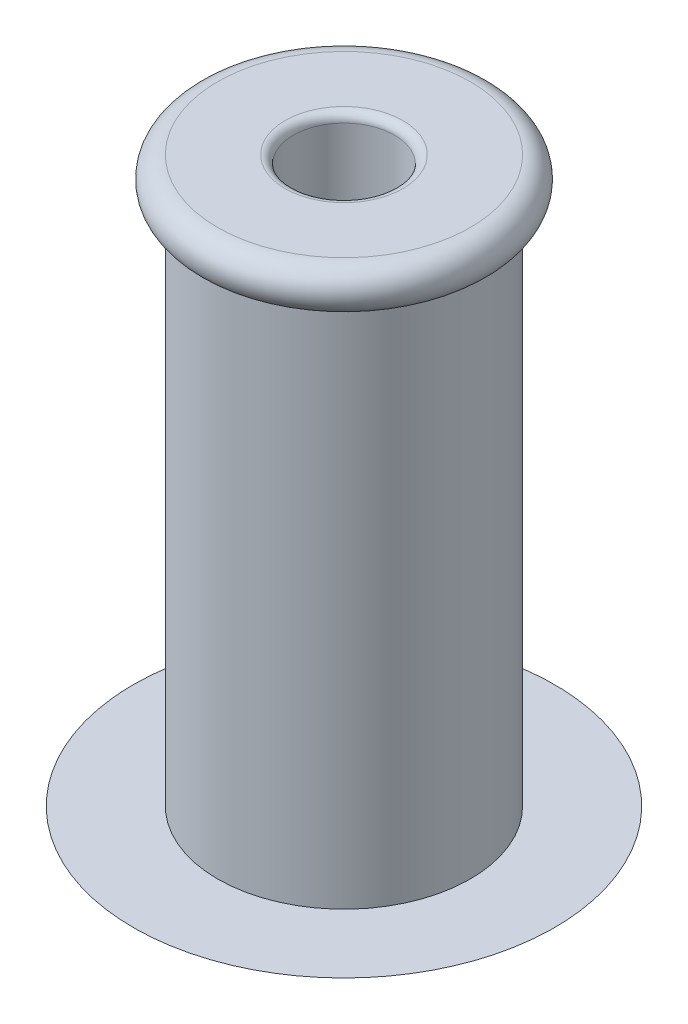
ISO-10303-21;
HEADER;
FILE_DESCRIPTION(('STEP AP214'),'2;1');
FILE_NAME('part.step','',(''),(''),'','','');
FILE_SCHEMA(('AUTOMOTIVE_DESIGN { 1 0 10303 214 1 1 1 1 }'));
ENDSEC;
DATA;
#1=APPLICATION_CONTEXT('core data for automotive mechanical design processes');
#2=APPLICATION_PROTOCOL_DEFINITION('international standard','automotive_design',2000,#1);
#3=PRODUCT_CONTEXT('',#1,'mechanical');
#4=PRODUCT('Part','Part','',(#3));
#5=PRODUCT_RELATED_PRODUCT_CATEGORY('part','',(#4));
#6=PRODUCT_DEFINITION_FORMATION('','',#4);
#7=PRODUCT_DEFINITION_CONTEXT('part definition',#1,'design');
#8=PRODUCT_DEFINITION('design','',#6,#7);
#9=PRODUCT_DEFINITION_SHAPE('','',#8);
#10=(LENGTH_UNIT() NAMED_UNIT(*) SI_UNIT(.MILLI.,.METRE.));
#11=(NAMED_UNIT(*) PLANE_ANGLE_UNIT() SI_UNIT($,.RADIAN.));
#12=(NAMED_UNIT(*) SI_UNIT($,.STERADIAN.) SOLID_ANGLE_UNIT());
#13=UNCERTAINTY_MEASURE_WITH_UNIT(LENGTH_MEASURE(1.E-05),#10,'distance_accuracy_value','');
#14=(GEOMETRIC_REPRESENTATION_CONTEXT(3) GLOBAL_UNCERTAINTY_ASSIGNED_CONTEXT((#13)) GLOBAL_UNIT_ASSIGNED_CONTEXT((#10,
#11,#12)) REPRESENTATION_CONTEXT('',''));
#15=CARTESIAN_POINT('',(0.,0.,0.));
#16=DIRECTION('',(0.,0.,1.));
#17=DIRECTION('',(1.,0.,0.));
#18=AXIS2_PLACEMENT_3D('',#15,#16,#17);
#19=CARTESIAN_POINT('',(0.,6.69999999999999,0.));
#20=DIRECTION('',(0.,1.,0.));
#21=DIRECTION('',(0.,0.,1.));
#22=AXIS2_PLACEMENT_3D('',#19,#20,#21);
#23=CYLINDRICAL_SURFACE('',#22,0.599999999999996);
#24=CARTESIAN_POINT('',(0.,-0.429212761787368,0.));
#25=DIRECTION('',(0.,1.,0.));
#26=DIRECTION('',(0.,0.,1.));
#27=AXIS2_PLACEMENT_3D('',#24,#25,#26);
#28=CIRCLE('',#27,0.599999999999996);
#29=CARTESIAN_POINT('',(0.,-0.429212761787368,0.599999999999996));
#30=VERTEX_POINT('',#29);
#31=EDGE_CURVE('E138',#30,#30,#28,.T.);
#32=ORIENTED_EDGE('',*,*,#31,.F.);
#33=EDGE_LOOP('',(#32));
#34=FACE_BOUND('',#33,.T.);
#35=CARTESIAN_POINT('',(0.,6.60000000003306,0.));
#36=DIRECTION('',(0.,1.,0.));
#37=DIRECTION('',(0.,0.,1.));
#38=AXIS2_PLACEMENT_3D('',#35,#36,#37);
#39=CIRCLE('',#38,0.599999999999998);
#40=CARTESIAN_POINT('',(0.,6.60000000003306,0.599999999999998));
#41=VERTEX_POINT('',#40);
#42=EDGE_CURVE('E130',#41,#41,#39,.F.);
#43=ORIENTED_EDGE('',*,*,#42,.F.);
#44=EDGE_LOOP('',(#43));
#45=FACE_BOUND('',#44,.T.);
#46=ADVANCED_FACE('F17',(#34,#45),#23,.F.);
#47=CARTESIAN_POINT('',(0.,-0.429212761787368,0.));
#48=DIRECTION('',(0.,1.,0.));
#49=DIRECTION('',(0.,0.,1.));
#50=AXIS2_PLACEMENT_3D('',#47,#48,#49);
#51=TOROIDAL_SURFACE('',#50,0.700035848417031,0.100035848417034);
#52=CARTESIAN_POINT('',(0.,-0.528480229082224,0.));
#53=DIRECTION('',(0.,1.,0.));
#54=DIRECTION('',(0.,0.,1.));
#55=AXIS2_PLACEMENT_3D('',#52,#53,#54);
#56=CIRCLE('',#55,0.712410859745534);
#57=CARTESIAN_POINT('',(0.,-0.528480229082224,0.712410859745534));
#58=VERTEX_POINT('',#57);
#59=EDGE_CURVE('E56',#58,#58,#56,.T.);
#60=ORIENTED_EDGE('',*,*,#59,.F.);
#61=EDGE_LOOP('',(#60));
#62=FACE_BOUND('',#61,.T.);
#63=ORIENTED_EDGE('',*,*,#31,.T.);
#64=EDGE_LOOP('',(#63));
#65=FACE_BOUND('',#64,.T.);
#66=ADVANCED_FACE('F146',(#62,#65),#51,.T.);
#67=CARTESIAN_POINT('',(0.,6.60000000003306,0.));
#68=DIRECTION('',(0.,1.,0.));
#69=DIRECTION('',(0.,0.,1.));
#70=AXIS2_PLACEMENT_3D('',#67,#68,#69);
#71=TOROIDAL_SURFACE('',#70,0.699999999966935,0.0999999999669373);
#72=ORIENTED_EDGE('',*,*,#42,.T.);
#73=EDGE_LOOP('',(#72));
#74=FACE_BOUND('',#73,.T.);
#75=CARTESIAN_POINT('',(0.,6.7,0.));
#76=DIRECTION('',(0.,1.,0.));
#77=DIRECTION('',(0.,0.,1.));
#78=AXIS2_PLACEMENT_3D('',#75,#76,#77);
#79=CIRCLE('',#78,0.699999999969966);
#80=CARTESIAN_POINT('',(0.,6.69999999999999,0.699999999971178));
#81=VERTEX_POINT('',#80);
#82=CARTESIAN_POINT('',(0.,6.69999999999999,-0.699999999971178));
#83=VERTEX_POINT('',#82);
#84=EDGE_CURVE('E47',#81,#83,#79,.T.);
#85=ORIENTED_EDGE('',*,*,#84,.T.);
#86=CARTESIAN_POINT('',(0.,6.7,0.));
#87=DIRECTION('',(0.,1.,0.));
#88=DIRECTION('',(0.,0.,-1.));
#89=AXIS2_PLACEMENT_3D('',#86,#87,#88);
#90=CIRCLE('',#89,0.699999999969966);
#91=EDGE_CURVE('E45',#83,#81,#90,.T.);
#92=ORIENTED_EDGE('',*,*,#91,.T.);
#93=EDGE_LOOP('',(#85,#92));
#94=FACE_BOUND('',#93,.T.);
#95=ADVANCED_FACE('F49',(#74,#94),#71,.T.);
#96=CARTESIAN_POINT('',(5.74704163652882E-10,5.16876422981444,0.));
#97=DIRECTION('',(1.,0.,0.));
#98=DIRECTION('',(0.,-1.,0.));
#99=AXIS2_PLACEMENT_3D('',#96,#97,#98);
#100=SPHERICAL_SURFACE('',#99,5.74161333221711);
#101=CARTESIAN_POINT('',(-2.49999999942357,6.48838540404442E-10,0.));
#102=CARTESIAN_POINT('',(-2.49999957878489,6.48831726204016E-10,-0.0701921599959424));
#103=CARTESIAN_POINT('',(-2.49704119285071,6.48806599485893E-10,-0.140397219697355));
#104=CARTESIAN_POINT('',(-2.48522688279269,6.48870978717356E-10,-0.280322179188547));
#105=CARTESIAN_POINT('',(-2.47636921753083,6.48960518517301E-10,-0.350041929601709));
#106=CARTESIAN_POINT('',(-2.45279619976664,6.48716856477371E-10,-0.488604766514141));
#107=CARTESIAN_POINT('',(-2.4380715488539,6.48382981738096E-10,-0.557446281525052));
#108=CARTESIAN_POINT('',(-2.40286605931459,6.49294957619581E-10,-0.693682439580464));
#109=CARTESIAN_POINT('',(-2.38238054950445,6.50542093090779E-10,-0.761075860507156));
#110=CARTESIAN_POINT('',(-2.31256595505668,6.51898547981041E-10,-0.960073508547201));
#111=CARTESIAN_POINT('',(-2.25482146080076,6.49640201267501E-10,-1.08883001715263));
#112=CARTESIAN_POINT('',(-2.11850508000272,6.4803733696389E-10,-1.33480670427791));
#113=CARTESIAN_POINT('',(-2.03993240172298,6.48692930155779E-10,-1.45202644402053));
#114=CARTESIAN_POINT('',(-1.90824104240077,6.48912864567597E-10,-1.61665670241038));
#115=CARTESIAN_POINT('',(-1.86200376338034,6.48858647756231E-10,-1.66969790909631));
#116=CARTESIAN_POINT('',(-1.76526174273879,6.48818940094947E-10,-1.77166010119695));
#117=CARTESIAN_POINT('',(-1.71476115857592,6.48833383033251E-10,-1.82058500981916));
#118=CARTESIAN_POINT('',(-1.60979378862723,6.48844188113362E-10,-1.91402800841851));
#119=CARTESIAN_POINT('',(-1.55532521654812,6.48840542061755E-10,-1.95854409210429));
#120=CARTESIAN_POINT('',(-1.44283652680054,6.48837026231001E-10,-2.04283394018589));
#121=CARTESIAN_POINT('',(-1.38481558947582,6.48837157326676E-10,-2.0826066038189));
#122=CARTESIAN_POINT('',(-1.20605688595961,6.48837809554355E-10,-2.19433902055693));
#123=CARTESIAN_POINT('',(-1.08051229794067,6.48838589359884E-10,-2.25881176834384));
#124=CARTESIAN_POINT('',(-0.820448664375309,6.48838979337895E-10,-2.36572576688446));
#125=CARTESIAN_POINT('',(-0.685929714696595,6.4883858952287E-10,-2.40816725294235));
#126=CARTESIAN_POINT('',(-0.411658452249914,6.48838762337019E-10,-2.46987540914088));
#127=CARTESIAN_POINT('',(-0.27190611153753,6.48839324971279E-10,-2.48914195551749));
#128=CARTESIAN_POINT('',(0.00884938408520357,6.48838243728583E-10,-2.50393336511436));
#129=CARTESIAN_POINT('',(0.149852538995552,6.48836599851625E-10,-2.49945822833461));
#130=CARTESIAN_POINT('',(0.429089566885955,6.48836848879317E-10,-2.46691127455344));
#131=CARTESIAN_POINT('',(0.567323454650985,6.48838741765079E-10,-2.43883958356721));
#132=CARTESIAN_POINT('',(0.837181598480677,6.48838826935238E-10,-2.35984414828166));
#133=CARTESIAN_POINT('',(0.968805783933406,6.4883701918011E-10,-2.3089201599073));
#134=CARTESIAN_POINT('',(1.15831539903678,6.48837715613109E-10,-2.21658970547161));
#135=CARTESIAN_POINT('',(1.2201943286004,6.48838517075551E-10,-2.18313388360806));
#136=CARTESIAN_POINT('',(1.34091721277493,6.48839051562421E-10,-2.11113062640851));
#137=CARTESIAN_POINT('',(1.39976186683971,6.48838784834212E-10,-2.0725843718686));
#138=CARTESIAN_POINT('',(1.51396685381964,6.4883878386587E-10,-1.99068831768951));
#139=CARTESIAN_POINT('',(1.56932875232432,6.48839049384689E-10,-1.94734070093333));
#140=CARTESIAN_POINT('',(1.67624909576441,6.48838519059393E-10,-1.85610831997998));
#141=CARTESIAN_POINT('',(1.72780381849562,6.48837722190731E-10,-1.80821921744076));
#142=CARTESIAN_POINT('',(1.87606499450712,6.48836681188863E-10,-1.6583380652391));
#143=CARTESIAN_POINT('',(1.96651979617871,6.48837781047235E-10,-1.55002342166796));
#144=CARTESIAN_POINT('',(2.12792802579951,6.48839787614484E-10,-1.31973215024518));
#145=CARTESIAN_POINT('',(2.19888219499795,6.48840694330701E-10,-1.1977560419351));
#146=CARTESIAN_POINT('',(2.28922037116787,6.48839739506078E-10,-1.00719593212774));
#147=CARTESIAN_POINT('',(2.31667397120977,6.48839033189682E-10,-0.94232815013128));
#148=CARTESIAN_POINT('',(2.36599984839916,6.48838535712372E-10,-0.810545468814853));
#149=CARTESIAN_POINT('',(2.38787664245458,6.48838743808326E-10,-0.743632275680957));
#150=CARTESIAN_POINT('',(2.42587892450651,6.48838824827128E-10,-0.608313490959032));
#151=CARTESIAN_POINT('',(2.44201349431108,6.48838698281935E-10,-0.539910439208492));
#152=CARTESIAN_POINT('',(2.4684652914803,6.48838870392521E-10,-0.402001503177163));
#153=CARTESIAN_POINT('',(2.47878423464813,6.48839168922797E-10,-0.332495950399554));
#154=CARTESIAN_POINT('',(2.49076984043968,6.48838326543593E-10,-0.219068891487443));
#155=CARTESIAN_POINT('',(2.4942300551381,6.48837683507477E-10,-0.175328990097495));
#156=CARTESIAN_POINT('',(2.49884526664322,6.48839885192385E-10,-0.0877277385033082));
#157=CARTESIAN_POINT('',(2.50000026344992,6.48842729913408E-10,-0.0438663882990687));
#158=CARTESIAN_POINT('',(2.4999995799343,6.48831625192481E-10,0.0701921599959423));
#159=CARTESIAN_POINT('',(2.49704119400011,6.48806572417351E-10,0.140397219697354));
#160=CARTESIAN_POINT('',(2.4852268839421,6.48871005793892E-10,0.280322179188546));
#161=CARTESIAN_POINT('',(2.47636921868024,6.48960525768236E-10,0.350041929601709));
#162=CARTESIAN_POINT('',(2.45279620091605,6.48716849214899E-10,0.488604766514141));
#163=CARTESIAN_POINT('',(2.4380715500033,6.48382979827868E-10,0.557446281525052));
#164=CARTESIAN_POINT('',(2.402866060464,6.49294959531362E-10,0.693682439580463));
#165=CARTESIAN_POINT('',(2.38238055065386,6.50542093466725E-10,0.761075860507155));
#166=CARTESIAN_POINT('',(2.31256595620608,6.51898547230941E-10,0.960073508547199));
#167=CARTESIAN_POINT('',(2.25482146195017,6.49640204384763E-10,1.08883001715263));
#168=CARTESIAN_POINT('',(2.11850508115213,6.48037333846509E-10,1.33480670427791));
#169=CARTESIAN_POINT('',(2.03993240287239,6.48692916935861E-10,1.45202644402053));
#170=CARTESIAN_POINT('',(1.90824104355018,6.48912871186218E-10,1.61665670241038));
#171=CARTESIAN_POINT('',(1.86200376452974,6.48858666839375E-10,1.6696979090963));
#172=CARTESIAN_POINT('',(1.7652617438882,6.48818921030201E-10,1.77166010119695));
#173=CARTESIAN_POINT('',(1.71476115972533,6.48833313416894E-10,1.82058500981916));
#174=CARTESIAN_POINT('',(1.60979378977664,6.48844257761254E-10,1.91402800841851));
#175=CARTESIAN_POINT('',(1.55532521769754,6.48840801634403E-10,1.9585440921043));
#176=CARTESIAN_POINT('',(1.44283652794995,6.48836766598233E-10,2.04283394018589));
#177=CARTESIAN_POINT('',(1.38481559062523,6.48836188355497E-10,2.0826066038189));
#178=CARTESIAN_POINT('',(1.20605688710902,6.4883584506126E-10,2.19433902055693));
#179=CARTESIAN_POINT('',(1.08051229909007,6.48837467339476E-10,2.25881176834384));
#180=CARTESIAN_POINT('',(0.820448665524719,6.48840101346319E-10,2.36572576688447));
#181=CARTESIAN_POINT('',(0.685929715846004,6.48841113081466E-10,2.40816725294236));
#182=CARTESIAN_POINT('',(0.411658453399323,6.48841009267243E-10,2.46987540914088));
#183=CARTESIAN_POINT('',(0.271906112686939,6.48839893706511E-10,2.4891419555175));
#184=CARTESIAN_POINT('',(-0.00884938293579447,6.48837674993351E-10,2.50393336511436));
#185=CARTESIAN_POINT('',(-0.149852537846143,6.48836571840922E-10,2.49945822833461));
#186=CARTESIAN_POINT('',(-0.429089565736546,6.48836876889871E-10,2.46691127455344));
#187=CARTESIAN_POINT('',(-0.567323453501576,6.48838285077837E-10,2.43883958356721));
#188=CARTESIAN_POINT('',(-0.837181597331268,6.48839283627357E-10,2.35984414828166));
#189=CARTESIAN_POINT('',(-0.968805782783997,6.48838873969495E-10,2.3089201599073));
#190=CARTESIAN_POINT('',(-1.15831539788737,6.48838739493386E-10,2.21658970547161));
#191=CARTESIAN_POINT('',(-1.22019432745099,6.48838774813497E-10,2.18313388360806));
#192=CARTESIAN_POINT('',(-1.34091721162552,6.48838793884157E-10,2.11113062640851));
#193=CARTESIAN_POINT('',(-1.3997618656903,6.48838777646646E-10,2.0725843718686));
#194=CARTESIAN_POINT('',(-1.51396685267023,6.48838791050181E-10,1.99068831768951));
#195=CARTESIAN_POINT('',(-1.56932875117491,6.48838820670457E-10,1.94734070093333));
#196=CARTESIAN_POINT('',(-1.676249094615,6.48838747994353E-10,1.85610831997998));
#197=CARTESIAN_POINT('',(-1.72780381734622,6.48838645570634E-10,1.80821921744076));
#198=CARTESIAN_POINT('',(-1.87606499335771,6.48838736568413E-10,1.65833806523911));
#199=CARTESIAN_POINT('',(-1.9665197950293,6.48839326949073E-10,1.55002342166796));
#200=CARTESIAN_POINT('',(-2.1279280246501,6.48838241771417E-10,1.31973215024517));
#201=CARTESIAN_POINT('',(-2.19888219384854,6.48836566299243E-10,1.1977560419351));
#202=CARTESIAN_POINT('',(-2.28922037001846,6.4883753600719E-10,1.00719593212774));
#203=CARTESIAN_POINT('',(-2.31667397006036,6.48838442891444E-10,0.942328150131279));
#204=CARTESIAN_POINT('',(-2.36599984724975,6.4883912553097E-10,0.810545468814852));
#205=CARTESIAN_POINT('',(-2.38787664130517,6.48838902204728E-10,0.743632275680957));
#206=CARTESIAN_POINT('',(-2.4258789233571,6.48838666682369E-10,0.608313490959032));
#207=CARTESIAN_POINT('',(-2.44201349316168,6.48838654151396E-10,0.539910439208493));
#208=CARTESIAN_POINT('',(-2.46846529033089,6.48838914510033E-10,0.402001503177164));
#209=CARTESIAN_POINT('',(-2.47878423349872,6.48839187315391E-10,0.332495950399555));
#210=CARTESIAN_POINT('',(-2.49076983929027,6.48838315049195E-10,0.219068891487444));
#211=CARTESIAN_POINT('',(-2.49423005398869,6.48837663382385E-10,0.175328990097496));
#212=CARTESIAN_POINT('',(-2.49884526549381,6.48839905317477E-10,0.0877277385033084));
#213=CARTESIAN_POINT('',(-2.50000026230051,6.4884279891938E-10,0.0438663882990687));
#214=CARTESIAN_POINT('',(-2.49999999942357,6.48838540404442E-10,0.));
#215=B_SPLINE_CURVE_WITH_KNOTS('',3,(#101,#102,#103,#104,#105,#106,#107,#108,#109,#110,#111,
#112,#113,#114,#115,#116,#117,#118,#119,#120,#121,#122,#123,#124,#125,#126,#127,#128,#129,#130,
#131,#132,#133,#134,#135,#136,#137,#138,#139,#140,#141,#142,#143,#144,#145,#146,#147,#148,#149,
#150,#151,#152,#153,#154,#155,#156,#157,#158,#159,#160,#161,#162,#163,#164,#165,#166,#167,#168,
#169,#170,#171,#172,#173,#174,#175,#176,#177,#178,#179,#180,#181,#182,#183,#184,#185,#186,#187,
#188,#189,#190,#191,#192,#193,#194,#195,#196,#197,#198,#199,#200,#201,#202,#203,#204,#205,#206,
#207,#208,#209,#210,#211,#212,#213,#214),.UNSPECIFIED.,.T.,.F.,(4,2,2,2,2,2,2,2,2,2,2,2,2,2,2,2,
2,2,2,2,2,2,2,2,2,2,2,2,2,2,2,2,2,2,2,2,2,2,2,2,2,2,2,2,2,2,2,2,2,2,2,2,2,2,2,2,4),(0.,
0.210536096819772,0.421134359698777,0.632067729617665,0.843172630150821,1.26437611909741,
1.68559562146504,1.89648135010267,2.10716375313514,2.31794159352937,2.52876825245605,
2.94998199753964,3.37119124377109,3.79240273942867,4.21361423508621,4.63482348131759,
5.05603722640125,5.26686388532797,5.47764172572227,5.68832412875473,5.89920985739225,
6.32042935975956,6.74163284870629,6.95273774923984,7.163671119159,7.37426938203807,
7.58480547885799,7.71637940641056,7.84795333396316,8.05848943078293,8.26908769366193,
8.48002106358082,8.69112596411398,9.11232945306057,9.5335489554282,9.74443468406582,
9.9551170870983,10.1658949274925,10.3767215864192,10.7979353315028,11.2191445777342,
11.6403560733918,12.0615675690494,12.4827768152808,12.9039905603644,13.1148172192911,
13.3255950596854,13.5362774627179,13.7471631913554,14.1683826937227,14.5895861826694,
14.800691083203,15.0116244531222,15.2222227160012,15.4327588128211,15.5643327403737,
15.6959066679263),.UNSPECIFIED.);
#216=CARTESIAN_POINT('',(-2.49999999942357,6.48838540404442E-10,0.));
#217=VERTEX_POINT('',#216);
#218=EDGE_CURVE('E131',#217,#217,#215,.T.);
#219=ORIENTED_EDGE('',*,*,#218,.T.);
#220=EDGE_LOOP('',(#219));
#221=FACE_BOUND('',#220,.T.);
#222=ORIENTED_EDGE('',*,*,#59,.T.);
#223=EDGE_LOOP('',(#222));
#224=FACE_BOUND('',#223,.T.);
#225=ADVANCED_FACE('F74',(#221,#224),#100,.T.);
#226=CARTESIAN_POINT('',(1.49999999999999,6.69999999999999,0.));
#227=DIRECTION('',(0.,-1.,0.));
#228=DIRECTION('',(0.,0.,-1.));
#229=AXIS2_PLACEMENT_3D('',#226,#227,#228);
#230=PLANE('',#229);
#231=CARTESIAN_POINT('',(0.,6.69999999999999,0.));
#232=DIRECTION('',(0.,-1.,0.));
#233=DIRECTION('',(0.,0.,1.));
#234=AXIS2_PLACEMENT_3D('',#231,#232,#233);
#235=CIRCLE('',#234,1.49999999999999);
#236=CARTESIAN_POINT('',(0.,6.69999999999999,1.49999999999999));
#237=VERTEX_POINT('',#236);
#238=CARTESIAN_POINT('',(0.,6.69999999999999,-1.49999999999999));
#239=VERTEX_POINT('',#238);
#240=EDGE_CURVE('E36',#237,#239,#235,.T.);
#241=ORIENTED_EDGE('',*,*,#240,.F.);
#242=CARTESIAN_POINT('',(0.,6.69999999999999,0.));
#243=DIRECTION('',(0.,-1.,0.));
#244=DIRECTION('',(0.,0.,-1.));
#245=AXIS2_PLACEMENT_3D('',#242,#243,#244);
#246=CIRCLE('',#245,1.49999999999999);
#247=EDGE_CURVE('E94',#239,#237,#246,.T.);
#248=ORIENTED_EDGE('',*,*,#247,.F.);
#249=EDGE_LOOP('',(#241,#248));
#250=FACE_BOUND('',#249,.T.);
#251=ORIENTED_EDGE('',*,*,#91,.F.);
#252=ORIENTED_EDGE('',*,*,#84,.F.);
#253=EDGE_LOOP('',(#251,#252));
#254=FACE_BOUND('',#253,.T.);
#255=ADVANCED_FACE('F55',(#250,#254),#230,.F.);
#256=CARTESIAN_POINT('',(1.50000000057298,6.48838784349931E-10,0.));
#257=DIRECTION('',(0.,-1.,0.));
#258=DIRECTION('',(0.,0.,-1.));
#259=AXIS2_PLACEMENT_3D('',#256,#257,#258);
#260=PLANE('',#259);
#261=ORIENTED_EDGE('',*,*,#218,.F.);
#262=EDGE_LOOP('',(#261));
#263=FACE_BOUND('',#262,.T.);
#264=CARTESIAN_POINT('',(0.,6.48838621719605E-10,0.));
#265=DIRECTION('',(0.,1.,0.));
#266=DIRECTION('',(0.,0.,1.));
#267=AXIS2_PLACEMENT_3D('',#264,#265,#266);
#268=CIRCLE('',#267,1.50000000057298);
#269=CARTESIAN_POINT('',(0.,6.48838621719605E-10,1.50000000057298));
#270=VERTEX_POINT('',#269);
#271=EDGE_CURVE('E28',#270,#270,#268,.T.);
#272=ORIENTED_EDGE('',*,*,#271,.F.);
#273=EDGE_LOOP('',(#272));
#274=FACE_BOUND('',#273,.T.);
#275=ADVANCED_FACE('F73',(#263,#274),#260,.F.);
#276=CARTESIAN_POINT('',(0.,6.44999999999999,0.));
#277=DIRECTION('',(0.,1.,0.));
#278=DIRECTION('',(0.,0.,1.));
#279=AXIS2_PLACEMENT_3D('',#276,#277,#278);
#280=TOROIDAL_SURFACE('',#279,1.49999999999999,0.249999999999999);
#281=ORIENTED_EDGE('',*,*,#240,.T.);
#282=ORIENTED_EDGE('',*,*,#247,.T.);
#283=EDGE_LOOP('',(#281,#282));
#284=FACE_BOUND('',#283,.T.);
#285=CARTESIAN_POINT('',(0.,6.2,0.));
#286=DIRECTION('',(0.,1.,0.));
#287=DIRECTION('',(0.,0.,1.));
#288=AXIS2_PLACEMENT_3D('',#285,#286,#287);
#289=CIRCLE('',#288,1.50000000057298);
#290=CARTESIAN_POINT('',(0.,6.2,1.50000000057298));
#291=VERTEX_POINT('',#290);
#292=EDGE_CURVE('E10',#291,#291,#289,.F.);
#293=ORIENTED_EDGE('',*,*,#292,.F.);
#294=EDGE_LOOP('',(#293));
#295=FACE_BOUND('',#294,.T.);
#296=ADVANCED_FACE('F107',(#284,#295),#280,.T.);
#297=CARTESIAN_POINT('',(0.,6.69999999999999,0.));
#298=DIRECTION('',(0.,1.,0.));
#299=DIRECTION('',(0.,0.,1.));
#300=AXIS2_PLACEMENT_3D('',#297,#298,#299);
#301=CYLINDRICAL_SURFACE('',#300,1.50000000057298);
#302=ORIENTED_EDGE('',*,*,#292,.T.);
#303=EDGE_LOOP('',(#302));
#304=FACE_BOUND('',#303,.T.);
#305=ORIENTED_EDGE('',*,*,#271,.T.);
#306=EDGE_LOOP('',(#305));
#307=FACE_BOUND('',#306,.T.);
#308=ADVANCED_FACE('F116',(#304,#307),#301,.T.);
#309=CLOSED_SHELL('',(#46,#66,#95,#225,#255,#275,#296,#308));
#310=MANIFOLD_SOLID_BREP('B1',#309);
#311=ADVANCED_BREP_SHAPE_REPRESENTATION('',(#18,#310),#14);
#312=SHAPE_DEFINITION_REPRESENTATION(#9,#311);
ENDSEC;
END-ISO-10303-21;
